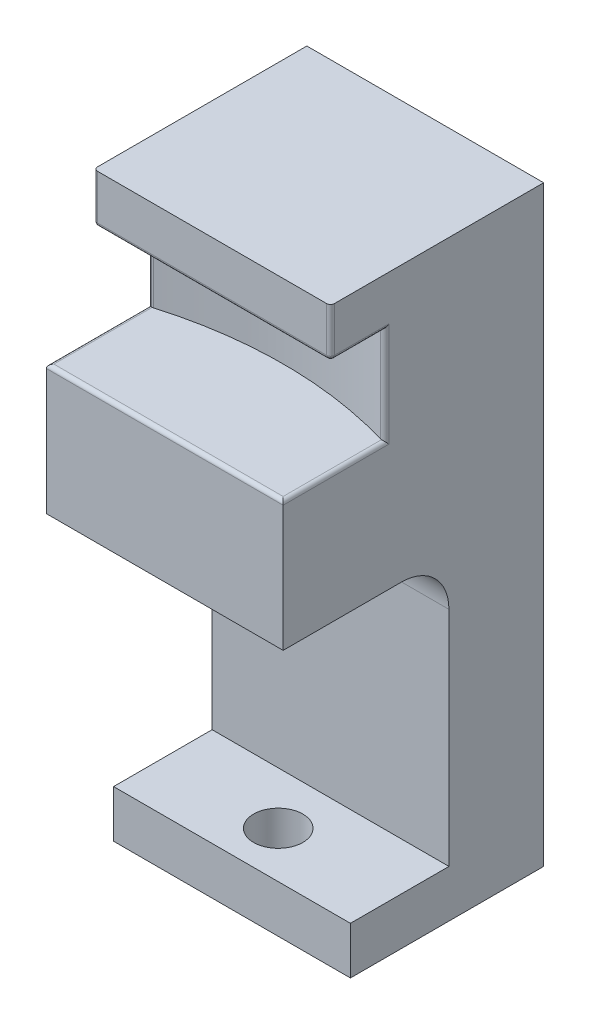
ISO-10303-21;
HEADER;
FILE_DESCRIPTION(('STEP AP214'),'2;1');
FILE_NAME('part.step','',(''),(''),'','','');
FILE_SCHEMA(('AUTOMOTIVE_DESIGN { 1 0 10303 214 1 1 1 1 }'));
ENDSEC;
DATA;
#1=APPLICATION_CONTEXT('core data for automotive mechanical design processes');
#2=APPLICATION_PROTOCOL_DEFINITION('international standard','automotive_design',2000,#1);
#3=PRODUCT_CONTEXT('',#1,'mechanical');
#4=PRODUCT('Part','Part','',(#3));
#5=PRODUCT_RELATED_PRODUCT_CATEGORY('part','',(#4));
#6=PRODUCT_DEFINITION_FORMATION('','',#4);
#7=PRODUCT_DEFINITION_CONTEXT('part definition',#1,'design');
#8=PRODUCT_DEFINITION('design','',#6,#7);
#9=PRODUCT_DEFINITION_SHAPE('','',#8);
#10=(LENGTH_UNIT() NAMED_UNIT(*) SI_UNIT(.MILLI.,.METRE.));
#11=(NAMED_UNIT(*) PLANE_ANGLE_UNIT() SI_UNIT($,.RADIAN.));
#12=(NAMED_UNIT(*) SI_UNIT($,.STERADIAN.) SOLID_ANGLE_UNIT());
#13=UNCERTAINTY_MEASURE_WITH_UNIT(LENGTH_MEASURE(1.E-05),#10,'distance_accuracy_value','');
#14=(GEOMETRIC_REPRESENTATION_CONTEXT(3) GLOBAL_UNCERTAINTY_ASSIGNED_CONTEXT((#13)) GLOBAL_UNIT_ASSIGNED_CONTEXT((#10,
#11,#12)) REPRESENTATION_CONTEXT('',''));
#15=CARTESIAN_POINT('',(0.,0.,0.));
#16=DIRECTION('',(0.,0.,1.));
#17=DIRECTION('',(1.,0.,0.));
#18=AXIS2_PLACEMENT_3D('',#15,#16,#17);
#19=CARTESIAN_POINT('',(0.,0.,6.35));
#20=DIRECTION('',(0.,0.,-1.));
#21=DIRECTION('',(-1.,0.,0.));
#22=AXIS2_PLACEMENT_3D('',#19,#20,#21);
#23=PLANE('',#22);
#24=DIRECTION('',(-1.,0.,0.));
#25=VECTOR('',#24,1.);
#26=CARTESIAN_POINT('',(0.,-1.5875,6.35));
#27=LINE('',#26,#25);
#28=CARTESIAN_POINT('',(15.875,-1.5875,6.35));
#29=VERTEX_POINT('',#28);
#30=CARTESIAN_POINT('',(0.,-1.5875,6.35));
#31=VERTEX_POINT('',#30);
#32=EDGE_CURVE('E204',#29,#31,#27,.T.);
#33=ORIENTED_EDGE('',*,*,#32,.F.);
#34=DIRECTION('',(0.,1.,0.));
#35=VECTOR('',#34,1.);
#36=CARTESIAN_POINT('',(15.875,0.,6.35));
#37=LINE('',#36,#35);
#38=CARTESIAN_POINT('',(15.875,13.335,6.35));
#39=VERTEX_POINT('',#38);
#40=EDGE_CURVE('E49',#29,#39,#37,.T.);
#41=ORIENTED_EDGE('',*,*,#40,.T.);
#42=DIRECTION('',(1.,0.,0.));
#43=VECTOR('',#42,1.);
#44=CARTESIAN_POINT('',(0.,13.335,6.35));
#45=LINE('',#44,#43);
#46=CARTESIAN_POINT('',(0.,13.335,6.35));
#47=VERTEX_POINT('',#46);
#48=EDGE_CURVE('E54',#39,#47,#45,.F.);
#49=ORIENTED_EDGE('',*,*,#48,.T.);
#50=DIRECTION('',(0.,-1.,0.));
#51=VECTOR('',#50,1.);
#52=CARTESIAN_POINT('',(0.,0.,6.35));
#53=LINE('',#52,#51);
#54=EDGE_CURVE('E243',#47,#31,#53,.T.);
#55=ORIENTED_EDGE('',*,*,#54,.T.);
#56=EDGE_LOOP('',(#33,#41,#49,#55));
#57=FACE_BOUND('',#56,.T.);
#58=ADVANCED_FACE('F34',(#57),#23,.F.);
#59=CARTESIAN_POINT('',(0.,0.,6.35));
#60=DIRECTION('',(1.,0.,0.));
#61=DIRECTION('',(0.,0.,-1.));
#62=AXIS2_PLACEMENT_3D('',#59,#60,#61);
#63=PLANE('',#62);
#64=DIRECTION('',(0.,0.,-1.));
#65=VECTOR('',#64,1.);
#66=CARTESIAN_POINT('',(0.,31.92145,14.2875));
#67=LINE('',#66,#65);
#68=CARTESIAN_POINT('',(0.,31.92145,10.364323153384));
#69=VERTEX_POINT('',#68);
#70=CARTESIAN_POINT('',(0.,31.92145,14.0335));
#71=VERTEX_POINT('',#70);
#72=EDGE_CURVE('E295',#69,#71,#67,.F.);
#73=ORIENTED_EDGE('',*,*,#72,.T.);
#74=DIRECTION('',(0.,-1.,0.));
#75=VECTOR('',#74,1.);
#76=CARTESIAN_POINT('',(0.,0.,14.0335));
#77=LINE('',#76,#75);
#78=CARTESIAN_POINT('',(0.,34.925,14.0335));
#79=VERTEX_POINT('',#78);
#80=EDGE_CURVE('E297',#71,#79,#77,.F.);
#81=ORIENTED_EDGE('',*,*,#80,.T.);
#82=DIRECTION('',(0.,0.,-1.));
#83=VECTOR('',#82,1.);
#84=CARTESIAN_POINT('',(0.,34.925,6.35));
#85=LINE('',#84,#83);
#86=CARTESIAN_POINT('',(0.,34.925,0.));
#87=VERTEX_POINT('',#86);
#88=EDGE_CURVE('E247',#79,#87,#85,.T.);
#89=ORIENTED_EDGE('',*,*,#88,.T.);
#90=DIRECTION('',(0.,-1.,0.));
#91=VECTOR('',#90,1.);
#92=CARTESIAN_POINT('',(0.,0.,0.));
#93=LINE('',#92,#91);
#94=CARTESIAN_POINT('',(0.,-4.7625,0.));
#95=VERTEX_POINT('',#94);
#96=EDGE_CURVE('E184',#87,#95,#93,.T.);
#97=ORIENTED_EDGE('',*,*,#96,.T.);
#98=DIRECTION('',(0.,0.,-1.));
#99=VECTOR('',#98,1.);
#100=CARTESIAN_POINT('',(0.,-4.7625,6.35));
#101=LINE('',#100,#99);
#102=CARTESIAN_POINT('',(0.,-4.7625,12.954));
#103=VERTEX_POINT('',#102);
#104=EDGE_CURVE('E177',#103,#95,#101,.T.);
#105=ORIENTED_EDGE('',*,*,#104,.F.);
#106=DIRECTION('',(0.,-1.,0.));
#107=VECTOR('',#106,1.);
#108=CARTESIAN_POINT('',(0.,-4.7625,12.954));
#109=LINE('',#108,#107);
#110=CARTESIAN_POINT('',(0.,-1.5875,12.954));
#111=VERTEX_POINT('',#110);
#112=EDGE_CURVE('E182',#111,#103,#109,.T.);
#113=ORIENTED_EDGE('',*,*,#112,.F.);
#114=DIRECTION('',(0.,0.,-1.));
#115=VECTOR('',#114,1.);
#116=CARTESIAN_POINT('',(0.,-1.5875,12.954));
#117=LINE('',#116,#115);
#118=EDGE_CURVE('E212',#111,#31,#117,.T.);
#119=ORIENTED_EDGE('',*,*,#118,.T.);
#120=ORIENTED_EDGE('',*,*,#54,.F.);
#121=CARTESIAN_POINT('',(0.,13.335,9.525));
#122=DIRECTION('',(1.,0.,0.));
#123=DIRECTION('',(0.,0.,-1.));
#124=AXIS2_PLACEMENT_3D('',#121,#122,#123);
#125=CIRCLE('',#124,3.175);
#126=CARTESIAN_POINT('',(0.,16.51,9.525));
#127=VERTEX_POINT('',#126);
#128=EDGE_CURVE('E11',#47,#127,#125,.T.);
#129=ORIENTED_EDGE('',*,*,#128,.T.);
#130=DIRECTION('',(0.,0.,-1.));
#131=VECTOR('',#130,1.);
#132=CARTESIAN_POINT('',(0.,16.51,14.2875));
#133=LINE('',#132,#131);
#134=CARTESIAN_POINT('',(0.,16.51,17.4625));
#135=VERTEX_POINT('',#134);
#136=EDGE_CURVE('E240',#135,#127,#133,.T.);
#137=ORIENTED_EDGE('',*,*,#136,.F.);
#138=DIRECTION('',(0.,-1.,0.));
#139=VECTOR('',#138,1.);
#140=CARTESIAN_POINT('',(0.,25.19045,17.4625));
#141=LINE('',#140,#139);
#142=CARTESIAN_POINT('',(0.,24.93645,17.4625));
#143=VERTEX_POINT('',#142);
#144=EDGE_CURVE('E226',#143,#135,#141,.T.);
#145=ORIENTED_EDGE('',*,*,#144,.F.);
#146=DIRECTION('',(0.,0.,-1.));
#147=VECTOR('',#146,1.);
#148=CARTESIAN_POINT('',(0.,24.93645,6.35));
#149=LINE('',#148,#147);
#150=CARTESIAN_POINT('',(0.,24.93645,10.364323153384));
#151=VERTEX_POINT('',#150);
#152=EDGE_CURVE('E291',#143,#151,#149,.T.);
#153=ORIENTED_EDGE('',*,*,#152,.T.);
#154=DIRECTION('',(0.,-1.,0.));
#155=VECTOR('',#154,1.);
#156=CARTESIAN_POINT('',(0.,0.,10.364323153384));
#157=LINE('',#156,#155);
#158=EDGE_CURVE('E293',#151,#69,#157,.F.);
#159=ORIENTED_EDGE('',*,*,#158,.T.);
#160=EDGE_LOOP('',(#73,#81,#89,#97,#105,#113,#119,#120,#129,#137,#145,#153,#159));
#161=FACE_BOUND('',#160,.T.);
#162=ADVANCED_FACE('F179',(#161),#63,.F.);
#163=CARTESIAN_POINT('',(15.875,0.,6.35));
#164=DIRECTION('',(-1.,0.,0.));
#165=DIRECTION('',(0.,0.,1.));
#166=AXIS2_PLACEMENT_3D('',#163,#164,#165);
#167=PLANE('',#166);
#168=DIRECTION('',(0.,0.,-1.));
#169=VECTOR('',#168,1.);
#170=CARTESIAN_POINT('',(15.875,34.925,6.35));
#171=LINE('',#170,#169);
#172=CARTESIAN_POINT('',(15.875,34.925,14.0335));
#173=VERTEX_POINT('',#172);
#174=CARTESIAN_POINT('',(15.875,34.925,0.));
#175=VERTEX_POINT('',#174);
#176=EDGE_CURVE('E255',#173,#175,#171,.T.);
#177=ORIENTED_EDGE('',*,*,#176,.F.);
#178=DIRECTION('',(0.,1.,0.));
#179=VECTOR('',#178,1.);
#180=CARTESIAN_POINT('',(15.875,0.,14.0335));
#181=LINE('',#180,#179);
#182=CARTESIAN_POINT('',(15.875,31.92145,14.0335));
#183=VERTEX_POINT('',#182);
#184=EDGE_CURVE('E283',#173,#183,#181,.F.);
#185=ORIENTED_EDGE('',*,*,#184,.T.);
#186=DIRECTION('',(0.,0.,1.));
#187=VECTOR('',#186,1.);
#188=CARTESIAN_POINT('',(15.875,31.92145,10.7059780652808));
#189=LINE('',#188,#187);
#190=CARTESIAN_POINT('',(15.875,31.92145,10.364323153384));
#191=VERTEX_POINT('',#190);
#192=EDGE_CURVE('E281',#183,#191,#189,.F.);
#193=ORIENTED_EDGE('',*,*,#192,.T.);
#194=DIRECTION('',(0.,-1.,0.));
#195=VECTOR('',#194,1.);
#196=CARTESIAN_POINT('',(15.875,0.,10.364323153384));
#197=LINE('',#196,#195);
#198=CARTESIAN_POINT('',(15.875,24.93645,10.364323153384));
#199=VERTEX_POINT('',#198);
#200=EDGE_CURVE('E277',#191,#199,#197,.T.);
#201=ORIENTED_EDGE('',*,*,#200,.T.);
#202=DIRECTION('',(0.,0.,1.));
#203=VECTOR('',#202,1.);
#204=CARTESIAN_POINT('',(15.875,24.93645,6.35));
#205=LINE('',#204,#203);
#206=CARTESIAN_POINT('',(15.875,24.93645,17.4625));
#207=VERTEX_POINT('',#206);
#208=EDGE_CURVE('E279',#199,#207,#205,.T.);
#209=ORIENTED_EDGE('',*,*,#208,.T.);
#210=DIRECTION('',(0.,1.,0.));
#211=VECTOR('',#210,1.);
#212=CARTESIAN_POINT('',(15.875,16.51,17.4625));
#213=LINE('',#212,#211);
#214=CARTESIAN_POINT('',(15.875,16.51,17.4625));
#215=VERTEX_POINT('',#214);
#216=EDGE_CURVE('E222',#215,#207,#213,.T.);
#217=ORIENTED_EDGE('',*,*,#216,.F.);
#218=DIRECTION('',(0.,0.,-1.));
#219=VECTOR('',#218,1.);
#220=CARTESIAN_POINT('',(15.875,16.51,14.2875));
#221=LINE('',#220,#219);
#222=CARTESIAN_POINT('',(15.875,16.51,9.525));
#223=VERTEX_POINT('',#222);
#224=EDGE_CURVE('E237',#215,#223,#221,.T.);
#225=ORIENTED_EDGE('',*,*,#224,.T.);
#226=CARTESIAN_POINT('',(15.875,13.335,9.525));
#227=DIRECTION('',(-1.,0.,0.));
#228=DIRECTION('',(0.,0.,1.));
#229=AXIS2_PLACEMENT_3D('',#226,#227,#228);
#230=CIRCLE('',#229,3.175);
#231=EDGE_CURVE('E42',#223,#39,#230,.T.);
#232=ORIENTED_EDGE('',*,*,#231,.T.);
#233=ORIENTED_EDGE('',*,*,#40,.F.);
#234=DIRECTION('',(0.,0.,-1.));
#235=VECTOR('',#234,1.);
#236=CARTESIAN_POINT('',(15.875,-1.5875,12.954));
#237=LINE('',#236,#235);
#238=CARTESIAN_POINT('',(15.875,-1.5875,12.954));
#239=VERTEX_POINT('',#238);
#240=EDGE_CURVE('E189',#239,#29,#237,.T.);
#241=ORIENTED_EDGE('',*,*,#240,.F.);
#242=DIRECTION('',(0.,1.,0.));
#243=VECTOR('',#242,1.);
#244=CARTESIAN_POINT('',(15.875,-4.7625,12.954));
#245=LINE('',#244,#243);
#246=CARTESIAN_POINT('',(15.875,-4.7625,12.954));
#247=VERTEX_POINT('',#246);
#248=EDGE_CURVE('E198',#247,#239,#245,.T.);
#249=ORIENTED_EDGE('',*,*,#248,.F.);
#250=DIRECTION('',(0.,0.,1.));
#251=VECTOR('',#250,1.);
#252=CARTESIAN_POINT('',(15.875,-4.7625,0.));
#253=LINE('',#252,#251);
#254=CARTESIAN_POINT('',(15.875,-4.7625,0.));
#255=VERTEX_POINT('',#254);
#256=EDGE_CURVE('E195',#255,#247,#253,.T.);
#257=ORIENTED_EDGE('',*,*,#256,.F.);
#258=DIRECTION('',(0.,1.,0.));
#259=VECTOR('',#258,1.);
#260=CARTESIAN_POINT('',(15.875,0.,0.));
#261=LINE('',#260,#259);
#262=EDGE_CURVE('E249',#255,#175,#261,.T.);
#263=ORIENTED_EDGE('',*,*,#262,.T.);
#264=EDGE_LOOP('',(#177,#185,#193,#201,#209,#217,#225,#232,#233,#241,#249,#257,#263));
#265=FACE_BOUND('',#264,.T.);
#266=ADVANCED_FACE('F350',(#265),#167,.F.);
#267=CARTESIAN_POINT('',(0.,0.,14.2875));
#268=DIRECTION('',(0.,0.,-1.));
#269=DIRECTION('',(-1.,0.,0.));
#270=AXIS2_PLACEMENT_3D('',#267,#268,#269);
#271=PLANE('',#270);
#272=DIRECTION('',(-1.,0.,0.));
#273=VECTOR('',#272,1.);
#274=CARTESIAN_POINT('',(15.875,31.92145,14.2875));
#275=LINE('',#274,#273);
#276=CARTESIAN_POINT('',(0.254,31.92145,14.2875));
#277=VERTEX_POINT('',#276);
#278=CARTESIAN_POINT('',(15.621,31.92145,14.2875));
#279=VERTEX_POINT('',#278);
#280=EDGE_CURVE('E269',#277,#279,#275,.F.);
#281=ORIENTED_EDGE('',*,*,#280,.T.);
#282=DIRECTION('',(0.,1.,0.));
#283=VECTOR('',#282,1.);
#284=CARTESIAN_POINT('',(15.621,0.,14.2875));
#285=LINE('',#284,#283);
#286=CARTESIAN_POINT('',(15.621,34.925,14.2875));
#287=VERTEX_POINT('',#286);
#288=EDGE_CURVE('E271',#279,#287,#285,.T.);
#289=ORIENTED_EDGE('',*,*,#288,.T.);
#290=DIRECTION('',(-1.,0.,0.));
#291=VECTOR('',#290,1.);
#292=CARTESIAN_POINT('',(0.,34.925,14.2875));
#293=LINE('',#292,#291);
#294=CARTESIAN_POINT('',(0.254,34.925,14.2875));
#295=VERTEX_POINT('',#294);
#296=EDGE_CURVE('E232',#287,#295,#293,.T.);
#297=ORIENTED_EDGE('',*,*,#296,.T.);
#298=DIRECTION('',(0.,-1.,0.));
#299=VECTOR('',#298,1.);
#300=CARTESIAN_POINT('',(0.254,0.,14.2875));
#301=LINE('',#300,#299);
#302=EDGE_CURVE('E267',#295,#277,#301,.T.);
#303=ORIENTED_EDGE('',*,*,#302,.T.);
#304=EDGE_LOOP('',(#281,#289,#297,#303));
#305=FACE_BOUND('',#304,.T.);
#306=ADVANCED_FACE('F416',(#305),#271,.F.);
#307=CARTESIAN_POINT('',(0.,34.925,6.35));
#308=DIRECTION('',(0.,-1.,0.));
#309=DIRECTION('',(0.,0.,-1.));
#310=AXIS2_PLACEMENT_3D('',#307,#308,#309);
#311=PLANE('',#310);
#312=ORIENTED_EDGE('',*,*,#296,.F.);
#313=CARTESIAN_POINT('',(15.621,34.925,14.0335));
#314=DIRECTION('',(0.,-1.,0.));
#315=DIRECTION('',(0.,0.,-1.));
#316=AXIS2_PLACEMENT_3D('',#313,#314,#315);
#317=CIRCLE('',#316,0.254);
#318=EDGE_CURVE('E275',#287,#173,#317,.F.);
#319=ORIENTED_EDGE('',*,*,#318,.T.);
#320=ORIENTED_EDGE('',*,*,#176,.T.);
#321=DIRECTION('',(-1.,0.,0.));
#322=VECTOR('',#321,1.);
#323=CARTESIAN_POINT('',(0.,34.925,0.));
#324=LINE('',#323,#322);
#325=EDGE_CURVE('E245',#175,#87,#324,.T.);
#326=ORIENTED_EDGE('',*,*,#325,.T.);
#327=ORIENTED_EDGE('',*,*,#88,.F.);
#328=CARTESIAN_POINT('',(0.254,34.925,14.0335));
#329=DIRECTION('',(0.,-1.,0.));
#330=DIRECTION('',(0.,0.,-1.));
#331=AXIS2_PLACEMENT_3D('',#328,#329,#330);
#332=CIRCLE('',#331,0.254);
#333=EDGE_CURVE('E273',#79,#295,#332,.F.);
#334=ORIENTED_EDGE('',*,*,#333,.T.);
#335=EDGE_LOOP('',(#312,#319,#320,#326,#327,#334));
#336=FACE_BOUND('',#335,.T.);
#337=ADVANCED_FACE('F419',(#336),#311,.F.);
#338=CARTESIAN_POINT('',(0.,0.,0.));
#339=DIRECTION('',(0.,0.,-1.));
#340=DIRECTION('',(-1.,0.,0.));
#341=AXIS2_PLACEMENT_3D('',#338,#339,#340);
#342=PLANE('',#341);
#343=ORIENTED_EDGE('',*,*,#96,.F.);
#344=ORIENTED_EDGE('',*,*,#325,.F.);
#345=ORIENTED_EDGE('',*,*,#262,.F.);
#346=DIRECTION('',(1.,0.,0.));
#347=VECTOR('',#346,1.);
#348=CARTESIAN_POINT('',(0.,-4.7625,0.));
#349=LINE('',#348,#347);
#350=EDGE_CURVE('E188',#95,#255,#349,.T.);
#351=ORIENTED_EDGE('',*,*,#350,.F.);
#352=EDGE_LOOP('',(#343,#344,#345,#351));
#353=FACE_BOUND('',#352,.T.);
#354=ADVANCED_FACE('F433',(#353),#342,.T.);
#355=CARTESIAN_POINT('',(0.,16.51,14.2875));
#356=DIRECTION('',(0.,1.,0.));
#357=DIRECTION('',(0.,0.,1.));
#358=AXIS2_PLACEMENT_3D('',#355,#356,#357);
#359=PLANE('',#358);
#360=ORIENTED_EDGE('',*,*,#136,.T.);
#361=DIRECTION('',(1.,0.,0.));
#362=VECTOR('',#361,1.);
#363=CARTESIAN_POINT('',(15.875,16.51,9.525));
#364=LINE('',#363,#362);
#365=EDGE_CURVE('E313',#127,#223,#364,.T.);
#366=ORIENTED_EDGE('',*,*,#365,.T.);
#367=ORIENTED_EDGE('',*,*,#224,.F.);
#368=DIRECTION('',(1.,0.,0.));
#369=VECTOR('',#368,1.);
#370=CARTESIAN_POINT('',(0.,16.51,17.4625));
#371=LINE('',#370,#369);
#372=EDGE_CURVE('E219',#135,#215,#371,.T.);
#373=ORIENTED_EDGE('',*,*,#372,.F.);
#374=EDGE_LOOP('',(#360,#366,#367,#373));
#375=FACE_BOUND('',#374,.T.);
#376=ADVANCED_FACE('F360',(#375),#359,.F.);
#377=CARTESIAN_POINT('',(7.9375,31.66745,36.4998));
#378=DIRECTION('',(0.,-1.,0.));
#379=DIRECTION('',(0.,0.,-1.));
#380=AXIS2_PLACEMENT_3D('',#377,#378,#379);
#381=CYLINDRICAL_SURFACE('',#380,26.9875);
#382=CARTESIAN_POINT('',(7.9375,31.66745,36.4998));
#383=DIRECTION('',(0.,-1.,0.));
#384=DIRECTION('',(0.,0.,-1.));
#385=AXIS2_PLACEMENT_3D('',#382,#383,#384);
#386=CIRCLE('',#385,26.9875);
#387=CARTESIAN_POINT('',(0.325641025641025,31.66745,10.6080105831893));
#388=VERTEX_POINT('',#387);
#389=CARTESIAN_POINT('',(15.549358974359,31.66745,10.6080105831893));
#390=VERTEX_POINT('',#389);
#391=EDGE_CURVE('E229',#388,#390,#386,.T.);
#392=ORIENTED_EDGE('',*,*,#391,.F.);
#393=DIRECTION('',(0.,-1.,0.));
#394=VECTOR('',#393,1.);
#395=CARTESIAN_POINT('',(0.325641025641026,31.66745,10.6080105831893));
#396=LINE('',#395,#394);
#397=CARTESIAN_POINT('',(0.325641025641025,25.19045,10.6080105831893));
#398=VERTEX_POINT('',#397);
#399=EDGE_CURVE('E301',#388,#398,#396,.T.);
#400=ORIENTED_EDGE('',*,*,#399,.T.);
#401=CARTESIAN_POINT('',(7.9375,25.19045,36.4998));
#402=DIRECTION('',(0.,-1.,0.));
#403=DIRECTION('',(0.,0.,-1.));
#404=AXIS2_PLACEMENT_3D('',#401,#402,#403);
#405=CIRCLE('',#404,26.9875);
#406=CARTESIAN_POINT('',(15.549358974359,25.19045,10.6080105831893));
#407=VERTEX_POINT('',#406);
#408=EDGE_CURVE('E228',#398,#407,#405,.T.);
#409=ORIENTED_EDGE('',*,*,#408,.T.);
#410=DIRECTION('',(0.,-1.,0.));
#411=VECTOR('',#410,1.);
#412=CARTESIAN_POINT('',(15.549358974359,31.66745,10.6080105831893));
#413=LINE('',#412,#411);
#414=EDGE_CURVE('E299',#407,#390,#413,.F.);
#415=ORIENTED_EDGE('',*,*,#414,.T.);
#416=EDGE_LOOP('',(#392,#400,#409,#415));
#417=FACE_BOUND('',#416,.T.);
#418=ADVANCED_FACE('F384',(#417),#381,.F.);
#419=CARTESIAN_POINT('',(7.9375,31.66745,36.4998));
#420=DIRECTION('',(0.,-1.,0.));
#421=DIRECTION('',(0.,0.,-1.));
#422=AXIS2_PLACEMENT_3D('',#419,#420,#421);
#423=PLANE('',#422);
#424=ORIENTED_EDGE('',*,*,#391,.T.);
#425=CARTESIAN_POINT('',(15.621,31.66745,10.364323153384));
#426=DIRECTION('',(0.,-1.,0.));
#427=DIRECTION('',(0.,0.,-1.));
#428=AXIS2_PLACEMENT_3D('',#425,#426,#427);
#429=CIRCLE('',#428,0.254);
#430=CARTESIAN_POINT('',(15.621,31.66745,10.618323153384));
#431=VERTEX_POINT('',#430);
#432=EDGE_CURVE('E310',#390,#431,#429,.F.);
#433=ORIENTED_EDGE('',*,*,#432,.T.);
#434=DIRECTION('',(0.,0.,1.));
#435=VECTOR('',#434,1.);
#436=CARTESIAN_POINT('',(15.621,31.66745,14.2875));
#437=LINE('',#436,#435);
#438=CARTESIAN_POINT('',(15.621,31.66745,14.0335));
#439=VERTEX_POINT('',#438);
#440=EDGE_CURVE('E289',#431,#439,#437,.T.);
#441=ORIENTED_EDGE('',*,*,#440,.T.);
#442=DIRECTION('',(-1.,0.,0.));
#443=VECTOR('',#442,1.);
#444=CARTESIAN_POINT('',(0.,31.66745,14.0335));
#445=LINE('',#444,#443);
#446=CARTESIAN_POINT('',(0.254,31.66745,14.0335));
#447=VERTEX_POINT('',#446);
#448=EDGE_CURVE('E287',#439,#447,#445,.T.);
#449=ORIENTED_EDGE('',*,*,#448,.T.);
#450=DIRECTION('',(0.,0.,-1.));
#451=VECTOR('',#450,1.);
#452=CARTESIAN_POINT('',(0.254,31.66745,10.7059780652808));
#453=LINE('',#452,#451);
#454=CARTESIAN_POINT('',(0.254,31.66745,10.618323153384));
#455=VERTEX_POINT('',#454);
#456=EDGE_CURVE('E285',#447,#455,#453,.T.);
#457=ORIENTED_EDGE('',*,*,#456,.T.);
#458=CARTESIAN_POINT('',(0.254,31.66745,10.364323153384));
#459=DIRECTION('',(0.,-1.,0.));
#460=DIRECTION('',(0.,0.,-1.));
#461=AXIS2_PLACEMENT_3D('',#458,#459,#460);
#462=CIRCLE('',#461,0.254);
#463=EDGE_CURVE('E303',#455,#388,#462,.F.);
#464=ORIENTED_EDGE('',*,*,#463,.T.);
#465=EDGE_LOOP('',(#424,#433,#441,#449,#457,#464));
#466=FACE_BOUND('',#465,.T.);
#467=ADVANCED_FACE('F388',(#466),#423,.T.);
#468=CARTESIAN_POINT('',(7.9375,25.19045,36.4998));
#469=DIRECTION('',(0.,-1.,0.));
#470=DIRECTION('',(0.,0.,-1.));
#471=AXIS2_PLACEMENT_3D('',#468,#469,#470);
#472=PLANE('',#471);
#473=CARTESIAN_POINT('',(0.254,25.19045,10.364323153384));
#474=DIRECTION('',(0.,-1.,0.));
#475=DIRECTION('',(0.,0.,-1.));
#476=AXIS2_PLACEMENT_3D('',#473,#474,#475);
#477=CIRCLE('',#476,0.254);
#478=CARTESIAN_POINT('',(0.254,25.19045,10.618323153384));
#479=VERTEX_POINT('',#478);
#480=EDGE_CURVE('E305',#398,#479,#477,.T.);
#481=ORIENTED_EDGE('',*,*,#480,.T.);
#482=DIRECTION('',(0.,0.,-1.));
#483=VECTOR('',#482,1.);
#484=CARTESIAN_POINT('',(0.254,25.19045,36.4998));
#485=LINE('',#484,#483);
#486=CARTESIAN_POINT('',(0.254,25.19045,17.2085));
#487=VERTEX_POINT('',#486);
#488=EDGE_CURVE('E265',#479,#487,#485,.F.);
#489=ORIENTED_EDGE('',*,*,#488,.T.);
#490=DIRECTION('',(-1.,0.,0.));
#491=VECTOR('',#490,1.);
#492=CARTESIAN_POINT('',(15.875,25.19045,17.2085));
#493=LINE('',#492,#491);
#494=CARTESIAN_POINT('',(15.621,25.19045,17.2085));
#495=VERTEX_POINT('',#494);
#496=EDGE_CURVE('E262',#487,#495,#493,.F.);
#497=ORIENTED_EDGE('',*,*,#496,.T.);
#498=DIRECTION('',(0.,0.,1.));
#499=VECTOR('',#498,1.);
#500=CARTESIAN_POINT('',(15.621,25.19045,36.4998));
#501=LINE('',#500,#499);
#502=CARTESIAN_POINT('',(15.621,25.19045,10.618323153384));
#503=VERTEX_POINT('',#502);
#504=EDGE_CURVE('E260',#495,#503,#501,.F.);
#505=ORIENTED_EDGE('',*,*,#504,.T.);
#506=CARTESIAN_POINT('',(15.621,25.19045,10.364323153384));
#507=DIRECTION('',(0.,-1.,0.));
#508=DIRECTION('',(0.,0.,-1.));
#509=AXIS2_PLACEMENT_3D('',#506,#507,#508);
#510=CIRCLE('',#509,0.254);
#511=EDGE_CURVE('E308',#503,#407,#510,.T.);
#512=ORIENTED_EDGE('',*,*,#511,.T.);
#513=ORIENTED_EDGE('',*,*,#408,.F.);
#514=EDGE_LOOP('',(#481,#489,#497,#505,#512,#513));
#515=FACE_BOUND('',#514,.T.);
#516=ADVANCED_FACE('F380',(#515),#472,.F.);
#517=CARTESIAN_POINT('',(0.,0.,17.4625));
#518=DIRECTION('',(0.,0.,1.));
#519=DIRECTION('',(1.,0.,0.));
#520=AXIS2_PLACEMENT_3D('',#517,#518,#519);
#521=PLANE('',#520);
#522=ORIENTED_EDGE('',*,*,#216,.T.);
#523=DIRECTION('',(-1.,0.,0.));
#524=VECTOR('',#523,1.);
#525=CARTESIAN_POINT('',(0.,24.93645,17.4625));
#526=LINE('',#525,#524);
#527=EDGE_CURVE('E257',#207,#143,#526,.T.);
#528=ORIENTED_EDGE('',*,*,#527,.T.);
#529=ORIENTED_EDGE('',*,*,#144,.T.);
#530=ORIENTED_EDGE('',*,*,#372,.T.);
#531=EDGE_LOOP('',(#522,#528,#529,#530));
#532=FACE_BOUND('',#531,.T.);
#533=ADVANCED_FACE('F362',(#532),#521,.T.);
#534=CARTESIAN_POINT('',(15.621,0.,14.0335));
#535=DIRECTION('',(0.,1.,0.));
#536=DIRECTION('',(0.,0.,1.));
#537=AXIS2_PLACEMENT_3D('',#534,#535,#536);
#538=CYLINDRICAL_SURFACE('',#537,0.254);
#539=ORIENTED_EDGE('',*,*,#318,.F.);
#540=ORIENTED_EDGE('',*,*,#288,.F.);
#541=CARTESIAN_POINT('',(15.621,31.92145,14.0335));
#542=DIRECTION('',(0.,-1.,0.));
#543=DIRECTION('',(0.,0.,-1.));
#544=AXIS2_PLACEMENT_3D('',#541,#542,#543);
#545=CIRCLE('',#544,0.254);
#546=EDGE_CURVE('E341',#183,#279,#545,.T.);
#547=ORIENTED_EDGE('',*,*,#546,.F.);
#548=ORIENTED_EDGE('',*,*,#184,.F.);
#549=EDGE_LOOP('',(#539,#540,#547,#548));
#550=FACE_BOUND('',#549,.T.);
#551=ADVANCED_FACE('F413',(#550),#538,.T.);
#552=CARTESIAN_POINT('',(0.254,0.,14.0335));
#553=DIRECTION('',(0.,-1.,0.));
#554=DIRECTION('',(0.,0.,-1.));
#555=AXIS2_PLACEMENT_3D('',#552,#553,#554);
#556=CYLINDRICAL_SURFACE('',#555,0.254);
#557=ORIENTED_EDGE('',*,*,#333,.F.);
#558=ORIENTED_EDGE('',*,*,#80,.F.);
#559=CARTESIAN_POINT('',(0.254,31.92145,14.0335));
#560=DIRECTION('',(0.,-1.,0.));
#561=DIRECTION('',(0.,0.,-1.));
#562=AXIS2_PLACEMENT_3D('',#559,#560,#561);
#563=CIRCLE('',#562,0.254);
#564=EDGE_CURVE('E338',#277,#71,#563,.T.);
#565=ORIENTED_EDGE('',*,*,#564,.F.);
#566=ORIENTED_EDGE('',*,*,#302,.F.);
#567=EDGE_LOOP('',(#557,#558,#565,#566));
#568=FACE_BOUND('',#567,.T.);
#569=ADVANCED_FACE('F424',(#568),#556,.T.);
#570=CARTESIAN_POINT('',(7.9375,31.92145,14.0335));
#571=DIRECTION('',(1.,0.,0.));
#572=DIRECTION('',(0.,0.,-1.));
#573=AXIS2_PLACEMENT_3D('',#570,#571,#572);
#574=CYLINDRICAL_SURFACE('',#573,0.254);
#575=CARTESIAN_POINT('',(15.621,31.92145,14.0335));
#576=DIRECTION('',(1.,0.,0.));
#577=DIRECTION('',(0.,0.,-1.));
#578=AXIS2_PLACEMENT_3D('',#575,#576,#577);
#579=CIRCLE('',#578,0.254);
#580=EDGE_CURVE('E223',#279,#439,#579,.T.);
#581=ORIENTED_EDGE('',*,*,#580,.F.);
#582=ORIENTED_EDGE('',*,*,#280,.F.);
#583=CARTESIAN_POINT('',(0.254,31.92145,14.0335));
#584=DIRECTION('',(-1.,0.,0.));
#585=DIRECTION('',(0.,0.,1.));
#586=AXIS2_PLACEMENT_3D('',#583,#584,#585);
#587=CIRCLE('',#586,0.254);
#588=EDGE_CURVE('E335',#447,#277,#587,.T.);
#589=ORIENTED_EDGE('',*,*,#588,.F.);
#590=ORIENTED_EDGE('',*,*,#448,.F.);
#591=EDGE_LOOP('',(#581,#582,#589,#590));
#592=FACE_BOUND('',#591,.T.);
#593=ADVANCED_FACE('F403',(#592),#574,.T.);
#594=CARTESIAN_POINT('',(15.621,31.92145,14.0335));
#595=DIRECTION('',(0.,0.,1.));
#596=DIRECTION('',(1.,0.,0.));
#597=AXIS2_PLACEMENT_3D('',#594,#595,#596);
#598=SPHERICAL_SURFACE('',#597,0.254);
#599=ORIENTED_EDGE('',*,*,#546,.T.);
#600=ORIENTED_EDGE('',*,*,#580,.T.);
#601=CARTESIAN_POINT('',(15.621,31.92145,14.0335));
#602=DIRECTION('',(0.,0.,1.));
#603=DIRECTION('',(1.,0.,0.));
#604=AXIS2_PLACEMENT_3D('',#601,#602,#603);
#605=CIRCLE('',#604,0.254);
#606=EDGE_CURVE('E332',#183,#439,#605,.F.);
#607=ORIENTED_EDGE('',*,*,#606,.F.);
#608=EDGE_LOOP('',(#599,#600,#607));
#609=FACE_BOUND('',#608,.T.);
#610=ADVANCED_FACE('F407',(#609),#598,.T.);
#611=CARTESIAN_POINT('',(0.254,31.92145,14.0335));
#612=DIRECTION('',(0.,0.,1.));
#613=DIRECTION('',(1.,0.,0.));
#614=AXIS2_PLACEMENT_3D('',#611,#612,#613);
#615=SPHERICAL_SURFACE('',#614,0.254);
#616=ORIENTED_EDGE('',*,*,#588,.T.);
#617=ORIENTED_EDGE('',*,*,#564,.T.);
#618=CARTESIAN_POINT('',(0.254,31.92145,14.0335));
#619=DIRECTION('',(0.,0.,1.));
#620=DIRECTION('',(0.,-1.,0.));
#621=AXIS2_PLACEMENT_3D('',#618,#619,#620);
#622=CIRCLE('',#621,0.254);
#623=EDGE_CURVE('E329',#447,#71,#622,.F.);
#624=ORIENTED_EDGE('',*,*,#623,.F.);
#625=EDGE_LOOP('',(#616,#617,#624));
#626=FACE_BOUND('',#625,.T.);
#627=ADVANCED_FACE('F427',(#626),#615,.T.);
#628=CARTESIAN_POINT('',(15.621,31.92145,36.4998));
#629=DIRECTION('',(0.,0.,-1.));
#630=DIRECTION('',(-1.,0.,0.));
#631=AXIS2_PLACEMENT_3D('',#628,#629,#630);
#632=CYLINDRICAL_SURFACE('',#631,0.254);
#633=ORIENTED_EDGE('',*,*,#440,.F.);
#634=CARTESIAN_POINT('',(15.621,31.92145,10.364323153384));
#635=DIRECTION('',(0.,-0.707106781186547,-0.707106781186547));
#636=DIRECTION('',(0.,0.707106781186547,-0.707106781186547));
#637=AXIS2_PLACEMENT_3D('',#634,#635,#636);
#638=ELLIPSE('',#637,0.359210244842766,0.254);
#639=EDGE_CURVE('E326',#191,#431,#638,.T.);
#640=ORIENTED_EDGE('',*,*,#639,.F.);
#641=ORIENTED_EDGE('',*,*,#192,.F.);
#642=ORIENTED_EDGE('',*,*,#606,.T.);
#643=EDGE_LOOP('',(#633,#640,#641,#642));
#644=FACE_BOUND('',#643,.T.);
#645=ADVANCED_FACE('F397',(#644),#632,.T.);
#646=CARTESIAN_POINT('',(0.254,31.92145,36.4998));
#647=DIRECTION('',(0.,0.,1.));
#648=DIRECTION('',(1.,0.,0.));
#649=AXIS2_PLACEMENT_3D('',#646,#647,#648);
#650=CYLINDRICAL_SURFACE('',#649,0.254);
#651=ORIENTED_EDGE('',*,*,#623,.T.);
#652=ORIENTED_EDGE('',*,*,#72,.F.);
#653=CARTESIAN_POINT('',(0.254,31.92145,10.364323153384));
#654=DIRECTION('',(0.,0.707106781186547,0.707106781186547));
#655=DIRECTION('',(0.,-0.707106781186547,0.707106781186547));
#656=AXIS2_PLACEMENT_3D('',#653,#654,#655);
#657=ELLIPSE('',#656,0.359210244842766,0.254);
#658=EDGE_CURVE('E323',#455,#69,#657,.F.);
#659=ORIENTED_EDGE('',*,*,#658,.F.);
#660=ORIENTED_EDGE('',*,*,#456,.F.);
#661=EDGE_LOOP('',(#651,#652,#659,#660));
#662=FACE_BOUND('',#661,.T.);
#663=ADVANCED_FACE('F430',(#662),#650,.T.);
#664=CARTESIAN_POINT('',(15.621,31.66745,10.364323153384));
#665=DIRECTION('',(0.,-1.,0.));
#666=DIRECTION('',(0.,0.,-1.));
#667=AXIS2_PLACEMENT_3D('',#664,#665,#666);
#668=CYLINDRICAL_SURFACE('',#667,0.254);
#669=ORIENTED_EDGE('',*,*,#414,.F.);
#670=ORIENTED_EDGE('',*,*,#511,.F.);
#671=CARTESIAN_POINT('',(15.621,24.93645,10.364323153384));
#672=DIRECTION('',(0.,-0.707106781186547,0.707106781186547));
#673=DIRECTION('',(0.,0.707106781186547,0.707106781186547));
#674=AXIS2_PLACEMENT_3D('',#671,#672,#673);
#675=ELLIPSE('',#674,0.359210244842766,0.254);
#676=EDGE_CURVE('E320',#199,#503,#675,.T.);
#677=ORIENTED_EDGE('',*,*,#676,.F.);
#678=ORIENTED_EDGE('',*,*,#200,.F.);
#679=ORIENTED_EDGE('',*,*,#639,.T.);
#680=ORIENTED_EDGE('',*,*,#432,.F.);
#681=EDGE_LOOP('',(#669,#670,#677,#678,#679,#680));
#682=FACE_BOUND('',#681,.T.);
#683=ADVANCED_FACE('F390',(#682),#668,.T.);
#684=CARTESIAN_POINT('',(0.254,31.66745,10.364323153384));
#685=DIRECTION('',(0.,-1.,0.));
#686=DIRECTION('',(0.,0.,-1.));
#687=AXIS2_PLACEMENT_3D('',#684,#685,#686);
#688=CYLINDRICAL_SURFACE('',#687,0.254);
#689=ORIENTED_EDGE('',*,*,#658,.T.);
#690=ORIENTED_EDGE('',*,*,#158,.F.);
#691=CARTESIAN_POINT('',(0.254,24.93645,10.364323153384));
#692=DIRECTION('',(0.,-0.707106781186547,0.707106781186547));
#693=DIRECTION('',(0.,-0.707106781186547,-0.707106781186547));
#694=AXIS2_PLACEMENT_3D('',#691,#692,#693);
#695=ELLIPSE('',#694,0.359210244842766,0.254);
#696=EDGE_CURVE('E317',#479,#151,#695,.T.);
#697=ORIENTED_EDGE('',*,*,#696,.F.);
#698=ORIENTED_EDGE('',*,*,#480,.F.);
#699=ORIENTED_EDGE('',*,*,#399,.F.);
#700=ORIENTED_EDGE('',*,*,#463,.F.);
#701=EDGE_LOOP('',(#689,#690,#697,#698,#699,#700));
#702=FACE_BOUND('',#701,.T.);
#703=ADVANCED_FACE('F372',(#702),#688,.T.);
#704=CARTESIAN_POINT('',(15.621,24.93645,6.35));
#705=DIRECTION('',(0.,0.,1.));
#706=DIRECTION('',(1.,0.,0.));
#707=AXIS2_PLACEMENT_3D('',#704,#705,#706);
#708=CYLINDRICAL_SURFACE('',#707,0.254);
#709=ORIENTED_EDGE('',*,*,#676,.T.);
#710=ORIENTED_EDGE('',*,*,#504,.F.);
#711=CARTESIAN_POINT('',(15.621,24.93645,17.2085));
#712=DIRECTION('',(-0.707106781186547,0.,0.707106781186547));
#713=DIRECTION('',(0.707106781186547,0.,0.707106781186547));
#714=AXIS2_PLACEMENT_3D('',#711,#712,#713);
#715=ELLIPSE('',#714,0.359210244842766,0.254);
#716=EDGE_CURVE('E315',#207,#495,#715,.T.);
#717=ORIENTED_EDGE('',*,*,#716,.F.);
#718=ORIENTED_EDGE('',*,*,#208,.F.);
#719=EDGE_LOOP('',(#709,#710,#717,#718));
#720=FACE_BOUND('',#719,.T.);
#721=ADVANCED_FACE('F457',(#720),#708,.T.);
#722=CARTESIAN_POINT('',(0.254,24.93645,6.35));
#723=DIRECTION('',(0.,0.,-1.));
#724=DIRECTION('',(-1.,0.,0.));
#725=AXIS2_PLACEMENT_3D('',#722,#723,#724);
#726=CYLINDRICAL_SURFACE('',#725,0.254);
#727=ORIENTED_EDGE('',*,*,#696,.T.);
#728=ORIENTED_EDGE('',*,*,#152,.F.);
#729=CARTESIAN_POINT('',(0.254,24.93645,17.2085));
#730=DIRECTION('',(-0.707106781186547,0.,-0.707106781186547));
#731=DIRECTION('',(0.707106781186547,0.,-0.707106781186547));
#732=AXIS2_PLACEMENT_3D('',#729,#730,#731);
#733=ELLIPSE('',#732,0.359210244842766,0.254);
#734=EDGE_CURVE('E218',#487,#143,#733,.F.);
#735=ORIENTED_EDGE('',*,*,#734,.F.);
#736=ORIENTED_EDGE('',*,*,#488,.F.);
#737=EDGE_LOOP('',(#727,#728,#735,#736));
#738=FACE_BOUND('',#737,.T.);
#739=ADVANCED_FACE('F376',(#738),#726,.T.);
#740=CARTESIAN_POINT('',(0.,24.93645,17.2085));
#741=DIRECTION('',(1.,0.,0.));
#742=DIRECTION('',(0.,0.,-1.));
#743=AXIS2_PLACEMENT_3D('',#740,#741,#742);
#744=CYLINDRICAL_SURFACE('',#743,0.254);
#745=ORIENTED_EDGE('',*,*,#716,.T.);
#746=ORIENTED_EDGE('',*,*,#496,.F.);
#747=ORIENTED_EDGE('',*,*,#734,.T.);
#748=ORIENTED_EDGE('',*,*,#527,.F.);
#749=EDGE_LOOP('',(#745,#746,#747,#748));
#750=FACE_BOUND('',#749,.T.);
#751=ADVANCED_FACE('F451',(#750),#744,.T.);
#752=CARTESIAN_POINT('',(0.,13.335,9.525));
#753=DIRECTION('',(-1.,0.,0.));
#754=DIRECTION('',(0.,0.,1.));
#755=AXIS2_PLACEMENT_3D('',#752,#753,#754);
#756=CYLINDRICAL_SURFACE('',#755,3.175);
#757=ORIENTED_EDGE('',*,*,#128,.F.);
#758=ORIENTED_EDGE('',*,*,#48,.F.);
#759=ORIENTED_EDGE('',*,*,#231,.F.);
#760=ORIENTED_EDGE('',*,*,#365,.F.);
#761=EDGE_LOOP('',(#757,#758,#759,#760));
#762=FACE_BOUND('',#761,.T.);
#763=ADVANCED_FACE('F36',(#762),#756,.F.);
#764=CARTESIAN_POINT('',(0.,-4.7625,0.));
#765=DIRECTION('',(0.,-1.,0.));
#766=DIRECTION('',(0.,0.,-1.));
#767=AXIS2_PLACEMENT_3D('',#764,#765,#766);
#768=PLANE('',#767);
#769=CARTESIAN_POINT('',(7.9375,-4.7625,9.8552));
#770=DIRECTION('',(0.,-1.,0.));
#771=DIRECTION('',(0.,0.,-1.));
#772=AXIS2_PLACEMENT_3D('',#769,#770,#771);
#773=CIRCLE('',#772,1.651);
#774=CARTESIAN_POINT('',(7.9375,-4.7625,8.2042));
#775=VERTEX_POINT('',#774);
#776=EDGE_CURVE('E206',#775,#775,#773,.T.);
#777=ORIENTED_EDGE('',*,*,#776,.F.);
#778=EDGE_LOOP('',(#777));
#779=FACE_BOUND('',#778,.T.);
#780=ORIENTED_EDGE('',*,*,#104,.T.);
#781=ORIENTED_EDGE('',*,*,#350,.T.);
#782=ORIENTED_EDGE('',*,*,#256,.T.);
#783=DIRECTION('',(1.,0.,0.));
#784=VECTOR('',#783,1.);
#785=CARTESIAN_POINT('',(0.,-4.7625,12.954));
#786=LINE('',#785,#784);
#787=EDGE_CURVE('E192',#103,#247,#786,.T.);
#788=ORIENTED_EDGE('',*,*,#787,.F.);
#789=EDGE_LOOP('',(#780,#781,#782,#788));
#790=FACE_BOUND('',#789,.T.);
#791=ADVANCED_FACE('F193',(#779,#790),#768,.T.);
#792=CARTESIAN_POINT('',(0.,-1.5875,12.954));
#793=DIRECTION('',(0.,-1.,0.));
#794=DIRECTION('',(0.,0.,-1.));
#795=AXIS2_PLACEMENT_3D('',#792,#793,#794);
#796=PLANE('',#795);
#797=CARTESIAN_POINT('',(7.9375,-1.5875,9.8552));
#798=DIRECTION('',(0.,-1.,0.));
#799=DIRECTION('',(0.,0.,-1.));
#800=AXIS2_PLACEMENT_3D('',#797,#798,#799);
#801=CIRCLE('',#800,1.651);
#802=CARTESIAN_POINT('',(7.9375,-1.5875,8.2042));
#803=VERTEX_POINT('',#802);
#804=EDGE_CURVE('E713',#803,#803,#801,.F.);
#805=ORIENTED_EDGE('',*,*,#804,.F.);
#806=EDGE_LOOP('',(#805));
#807=FACE_BOUND('',#806,.T.);
#808=ORIENTED_EDGE('',*,*,#32,.T.);
#809=ORIENTED_EDGE('',*,*,#118,.F.);
#810=DIRECTION('',(-1.,0.,0.));
#811=VECTOR('',#810,1.);
#812=CARTESIAN_POINT('',(0.,-1.5875,12.954));
#813=LINE('',#812,#811);
#814=EDGE_CURVE('E202',#239,#111,#813,.T.);
#815=ORIENTED_EDGE('',*,*,#814,.F.);
#816=ORIENTED_EDGE('',*,*,#240,.T.);
#817=EDGE_LOOP('',(#808,#809,#815,#816));
#818=FACE_BOUND('',#817,.T.);
#819=ADVANCED_FACE('F435',(#807,#818),#796,.F.);
#820=CARTESIAN_POINT('',(0.,0.,12.954));
#821=DIRECTION('',(0.,0.,-1.));
#822=DIRECTION('',(-1.,0.,0.));
#823=AXIS2_PLACEMENT_3D('',#820,#821,#822);
#824=PLANE('',#823);
#825=ORIENTED_EDGE('',*,*,#112,.T.);
#826=ORIENTED_EDGE('',*,*,#787,.T.);
#827=ORIENTED_EDGE('',*,*,#248,.T.);
#828=ORIENTED_EDGE('',*,*,#814,.T.);
#829=EDGE_LOOP('',(#825,#826,#827,#828));
#830=FACE_BOUND('',#829,.T.);
#831=ADVANCED_FACE('F200',(#830),#824,.F.);
#832=CARTESIAN_POINT('',(7.9375,34.926,9.8552));
#833=DIRECTION('',(0.,-1.,0.));
#834=DIRECTION('',(0.,0.,-1.));
#835=AXIS2_PLACEMENT_3D('',#832,#833,#834);
#836=CYLINDRICAL_SURFACE('',#835,1.651);
#837=ORIENTED_EDGE('',*,*,#776,.T.);
#838=EDGE_LOOP('',(#837));
#839=FACE_BOUND('',#838,.T.);
#840=ORIENTED_EDGE('',*,*,#804,.T.);
#841=EDGE_LOOP('',(#840));
#842=FACE_BOUND('',#841,.T.);
#843=ADVANCED_FACE('F622',(#839,#842),#836,.F.);
#844=CLOSED_SHELL('',(#58,#162,#266,#306,#337,#354,#376,#418,#467,#516,#533,#551,#569,#593,#610,
#627,#645,#663,#683,#703,#721,#739,#751,#763,#791,#819,#831,#843));
#845=MANIFOLD_SOLID_BREP('B2',#844);
#846=ADVANCED_BREP_SHAPE_REPRESENTATION('',(#18,#845),#14);
#847=SHAPE_DEFINITION_REPRESENTATION(#9,#846);
ENDSEC;
END-ISO-10303-21;
